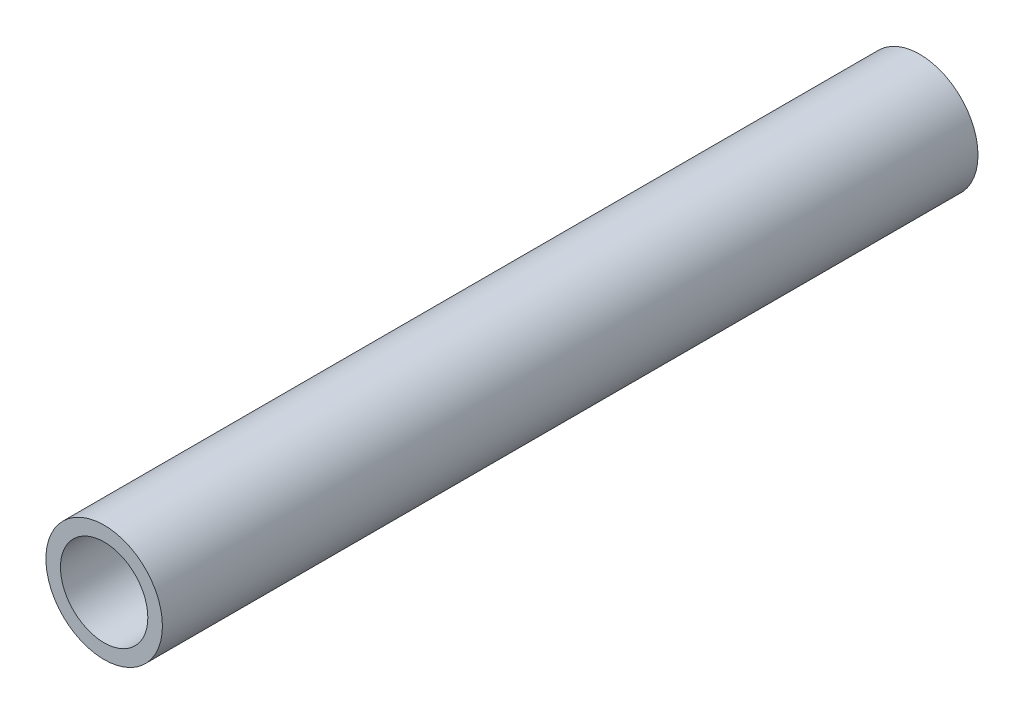
ISO-10303-21;
HEADER;
FILE_DESCRIPTION(('STEP AP214'),'2;1');
FILE_NAME('part.step','',(''),(''),'','','');
FILE_SCHEMA(('AUTOMOTIVE_DESIGN { 1 0 10303 214 1 1 1 1 }'));
ENDSEC;
DATA;
#1=APPLICATION_CONTEXT('core data for automotive mechanical design processes');
#2=APPLICATION_PROTOCOL_DEFINITION('international standard','automotive_design',2000,#1);
#3=PRODUCT_CONTEXT('',#1,'mechanical');
#4=PRODUCT('Part','Part','',(#3));
#5=PRODUCT_RELATED_PRODUCT_CATEGORY('part','',(#4));
#6=PRODUCT_DEFINITION_FORMATION('','',#4);
#7=PRODUCT_DEFINITION_CONTEXT('part definition',#1,'design');
#8=PRODUCT_DEFINITION('design','',#6,#7);
#9=PRODUCT_DEFINITION_SHAPE('','',#8);
#10=(LENGTH_UNIT() NAMED_UNIT(*) SI_UNIT(.MILLI.,.METRE.));
#11=(NAMED_UNIT(*) PLANE_ANGLE_UNIT() SI_UNIT($,.RADIAN.));
#12=(NAMED_UNIT(*) SI_UNIT($,.STERADIAN.) SOLID_ANGLE_UNIT());
#13=UNCERTAINTY_MEASURE_WITH_UNIT(LENGTH_MEASURE(1.E-05),#10,'distance_accuracy_value','');
#14=(GEOMETRIC_REPRESENTATION_CONTEXT(3) GLOBAL_UNCERTAINTY_ASSIGNED_CONTEXT((#13)) GLOBAL_UNIT_ASSIGNED_CONTEXT((#10,
#11,#12)) REPRESENTATION_CONTEXT('',''));
#15=CARTESIAN_POINT('',(0.,0.,0.));
#16=DIRECTION('',(0.,0.,1.));
#17=DIRECTION('',(1.,0.,0.));
#18=AXIS2_PLACEMENT_3D('',#15,#16,#17);
#19=CARTESIAN_POINT('',(0.,0.,177.8));
#20=DIRECTION('',(0.,0.,1.));
#21=DIRECTION('',(1.,0.,0.));
#22=AXIS2_PLACEMENT_3D('',#19,#20,#21);
#23=PLANE('',#22);
#24=CARTESIAN_POINT('',(0.,0.,177.8));
#25=DIRECTION('',(0.,0.,1.));
#26=DIRECTION('',(1.,0.,0.));
#27=AXIS2_PLACEMENT_3D('',#24,#25,#26);
#28=CIRCLE('',#27,12.7);
#29=CARTESIAN_POINT('',(12.7,0.,177.8));
#30=VERTEX_POINT('',#29);
#31=EDGE_CURVE('E10',#30,#30,#28,.T.);
#32=ORIENTED_EDGE('',*,*,#31,.T.);
#33=EDGE_LOOP('',(#32));
#34=FACE_BOUND('',#33,.T.);
#35=CARTESIAN_POINT('',(0.,0.,177.8));
#36=DIRECTION('',(0.,0.,1.));
#37=DIRECTION('',(1.,0.,0.));
#38=AXIS2_PLACEMENT_3D('',#35,#36,#37);
#39=CIRCLE('',#38,9.525);
#40=CARTESIAN_POINT('',(9.525,0.,177.8));
#41=VERTEX_POINT('',#40);
#42=EDGE_CURVE('E44',#41,#41,#39,.T.);
#43=ORIENTED_EDGE('',*,*,#42,.F.);
#44=EDGE_LOOP('',(#43));
#45=FACE_BOUND('',#44,.T.);
#46=ADVANCED_FACE('F33',(#34,#45),#23,.T.);
#47=CARTESIAN_POINT('',(0.,0.,0.));
#48=DIRECTION('',(0.,0.,1.));
#49=DIRECTION('',(1.,0.,0.));
#50=AXIS2_PLACEMENT_3D('',#47,#48,#49);
#51=PLANE('',#50);
#52=CARTESIAN_POINT('',(0.,0.,0.));
#53=DIRECTION('',(0.,0.,1.));
#54=DIRECTION('',(1.,0.,0.));
#55=AXIS2_PLACEMENT_3D('',#52,#53,#54);
#56=CIRCLE('',#55,12.7);
#57=CARTESIAN_POINT('',(12.7,0.,0.));
#58=VERTEX_POINT('',#57);
#59=EDGE_CURVE('E37',#58,#58,#56,.T.);
#60=ORIENTED_EDGE('',*,*,#59,.F.);
#61=EDGE_LOOP('',(#60));
#62=FACE_BOUND('',#61,.T.);
#63=CARTESIAN_POINT('',(0.,0.,0.));
#64=DIRECTION('',(0.,0.,1.));
#65=DIRECTION('',(1.,0.,0.));
#66=AXIS2_PLACEMENT_3D('',#63,#64,#65);
#67=CIRCLE('',#66,9.525);
#68=CARTESIAN_POINT('',(9.525,0.,0.));
#69=VERTEX_POINT('',#68);
#70=EDGE_CURVE('E46',#69,#69,#67,.T.);
#71=ORIENTED_EDGE('',*,*,#70,.T.);
#72=EDGE_LOOP('',(#71));
#73=FACE_BOUND('',#72,.T.);
#74=ADVANCED_FACE('F56',(#62,#73),#51,.F.);
#75=CARTESIAN_POINT('',(0.,0.,177.8));
#76=DIRECTION('',(0.,0.,-1.));
#77=DIRECTION('',(-1.,0.,0.));
#78=AXIS2_PLACEMENT_3D('',#75,#76,#77);
#79=CYLINDRICAL_SURFACE('',#78,12.7);
#80=ORIENTED_EDGE('',*,*,#31,.F.);
#81=EDGE_LOOP('',(#80));
#82=FACE_BOUND('',#81,.T.);
#83=ORIENTED_EDGE('',*,*,#59,.T.);
#84=EDGE_LOOP('',(#83));
#85=FACE_BOUND('',#84,.T.);
#86=ADVANCED_FACE('F35',(#82,#85),#79,.T.);
#87=CARTESIAN_POINT('',(0.,0.,177.8));
#88=DIRECTION('',(0.,0.,-1.));
#89=DIRECTION('',(-1.,0.,0.));
#90=AXIS2_PLACEMENT_3D('',#87,#88,#89);
#91=CYLINDRICAL_SURFACE('',#90,9.525);
#92=ORIENTED_EDGE('',*,*,#42,.T.);
#93=EDGE_LOOP('',(#92));
#94=FACE_BOUND('',#93,.T.);
#95=ORIENTED_EDGE('',*,*,#70,.F.);
#96=EDGE_LOOP('',(#95));
#97=FACE_BOUND('',#96,.T.);
#98=ADVANCED_FACE('F52',(#94,#97),#91,.F.);
#99=CLOSED_SHELL('',(#46,#74,#86,#98));
#100=MANIFOLD_SOLID_BREP('B2',#99);
#101=ADVANCED_BREP_SHAPE_REPRESENTATION('',(#18,#100),#14);
#102=SHAPE_DEFINITION_REPRESENTATION(#9,#101);
ENDSEC;
END-ISO-10303-21;
